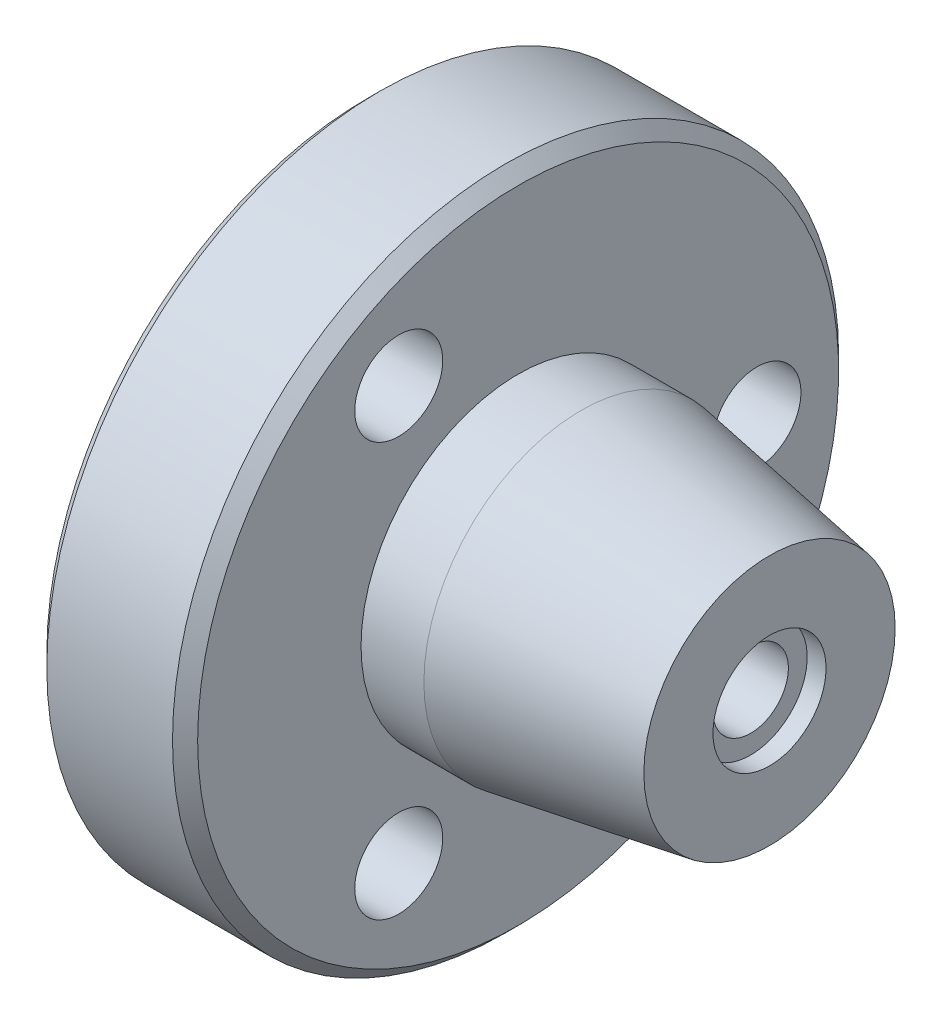
ISO-10303-21;
HEADER;
FILE_DESCRIPTION(('STEP AP214'),'2;1');
FILE_NAME('part.step','',(''),(''),'','','');
FILE_SCHEMA(('AUTOMOTIVE_DESIGN { 1 0 10303 214 1 1 1 1 }'));
ENDSEC;
DATA;
#1=APPLICATION_CONTEXT('core data for automotive mechanical design processes');
#2=APPLICATION_PROTOCOL_DEFINITION('international standard','automotive_design',2000,#1);
#3=PRODUCT_CONTEXT('',#1,'mechanical');
#4=PRODUCT('Part','Part','',(#3));
#5=PRODUCT_RELATED_PRODUCT_CATEGORY('part','',(#4));
#6=PRODUCT_DEFINITION_FORMATION('','',#4);
#7=PRODUCT_DEFINITION_CONTEXT('part definition',#1,'design');
#8=PRODUCT_DEFINITION('design','',#6,#7);
#9=PRODUCT_DEFINITION_SHAPE('','',#8);
#10=(LENGTH_UNIT() NAMED_UNIT(*) SI_UNIT(.MILLI.,.METRE.));
#11=(NAMED_UNIT(*) PLANE_ANGLE_UNIT() SI_UNIT($,.RADIAN.));
#12=(NAMED_UNIT(*) SI_UNIT($,.STERADIAN.) SOLID_ANGLE_UNIT());
#13=UNCERTAINTY_MEASURE_WITH_UNIT(LENGTH_MEASURE(1.E-05),#10,'distance_accuracy_value','');
#14=(GEOMETRIC_REPRESENTATION_CONTEXT(3) GLOBAL_UNCERTAINTY_ASSIGNED_CONTEXT((#13)) GLOBAL_UNIT_ASSIGNED_CONTEXT((#10,
#11,#12)) REPRESENTATION_CONTEXT('',''));
#15=CARTESIAN_POINT('',(0.,0.,0.));
#16=DIRECTION('',(0.,0.,1.));
#17=DIRECTION('',(1.,0.,0.));
#18=AXIS2_PLACEMENT_3D('',#15,#16,#17);
#19=CARTESIAN_POINT('',(0.,4.5,0.));
#20=DIRECTION('',(1.,0.,0.));
#21=DIRECTION('',(0.,0.,-1.));
#22=AXIS2_PLACEMENT_3D('',#19,#20,#21);
#23=PLANE('',#22);
#24=CARTESIAN_POINT('',(0.,0.,0.));
#25=DIRECTION('',(-1.,0.,0.));
#26=DIRECTION('',(0.,0.,1.));
#27=AXIS2_PLACEMENT_3D('',#24,#25,#26);
#28=CIRCLE('',#27,4.5);
#29=CARTESIAN_POINT('',(0.,0.,4.5));
#30=VERTEX_POINT('',#29);
#31=EDGE_CURVE('E67',#30,#30,#28,.T.);
#32=ORIENTED_EDGE('',*,*,#31,.F.);
#33=EDGE_LOOP('',(#32));
#34=FACE_BOUND('',#33,.T.);
#35=CARTESIAN_POINT('',(0.,0.,0.));
#36=DIRECTION('',(-1.,0.,0.));
#37=DIRECTION('',(0.,0.,1.));
#38=AXIS2_PLACEMENT_3D('',#35,#36,#37);
#39=CIRCLE('',#38,11.5);
#40=CARTESIAN_POINT('',(0.,0.,11.5));
#41=VERTEX_POINT('',#40);
#42=EDGE_CURVE('E10',#41,#41,#39,.T.);
#43=ORIENTED_EDGE('',*,*,#42,.T.);
#44=EDGE_LOOP('',(#43));
#45=FACE_BOUND('',#44,.T.);
#46=ADVANCED_FACE('F33',(#34,#45),#23,.F.);
#47=CARTESIAN_POINT('',(1.,0.,0.));
#48=DIRECTION('',(1.,0.,0.));
#49=DIRECTION('',(0.,0.,-1.));
#50=AXIS2_PLACEMENT_3D('',#47,#48,#49);
#51=CONICAL_SURFACE('',#50,12.5,0.785398163397449);
#52=ORIENTED_EDGE('',*,*,#42,.F.);
#53=EDGE_LOOP('',(#52));
#54=FACE_BOUND('',#53,.T.);
#55=CARTESIAN_POINT('',(1.,0.,0.));
#56=DIRECTION('',(-1.,0.,0.));
#57=DIRECTION('',(0.,0.,1.));
#58=AXIS2_PLACEMENT_3D('',#55,#56,#57);
#59=CIRCLE('',#58,12.5);
#60=CARTESIAN_POINT('',(1.,0.,12.5));
#61=VERTEX_POINT('',#60);
#62=EDGE_CURVE('E40',#61,#61,#59,.T.);
#63=ORIENTED_EDGE('',*,*,#62,.T.);
#64=EDGE_LOOP('',(#63));
#65=FACE_BOUND('',#64,.T.);
#66=ADVANCED_FACE('F192',(#54,#65),#51,.T.);
#67=CARTESIAN_POINT('',(0.,0.,0.));
#68=DIRECTION('',(-1.,0.,0.));
#69=DIRECTION('',(0.,0.,1.));
#70=AXIS2_PLACEMENT_3D('',#67,#68,#69);
#71=CYLINDRICAL_SURFACE('',#70,12.5);
#72=ORIENTED_EDGE('',*,*,#62,.F.);
#73=EDGE_LOOP('',(#72));
#74=FACE_BOUND('',#73,.T.);
#75=CARTESIAN_POINT('',(8.,0.,0.));
#76=DIRECTION('',(-1.,0.,0.));
#77=DIRECTION('',(0.,0.,1.));
#78=AXIS2_PLACEMENT_3D('',#75,#76,#77);
#79=CIRCLE('',#78,12.5);
#80=CARTESIAN_POINT('',(8.,0.,12.5));
#81=VERTEX_POINT('',#80);
#82=EDGE_CURVE('E45',#81,#81,#79,.T.);
#83=ORIENTED_EDGE('',*,*,#82,.T.);
#84=EDGE_LOOP('',(#83));
#85=FACE_BOUND('',#84,.T.);
#86=ADVANCED_FACE('F108',(#74,#85),#71,.T.);
#87=CARTESIAN_POINT('',(8.,12.5,0.));
#88=DIRECTION('',(1.,0.,0.));
#89=DIRECTION('',(0.,0.,-1.));
#90=AXIS2_PLACEMENT_3D('',#87,#88,#89);
#91=PLANE('',#90);
#92=CARTESIAN_POINT('',(8.,0.,-19.));
#93=DIRECTION('',(1.,0.,0.));
#94=DIRECTION('',(0.,0.,-1.));
#95=AXIS2_PLACEMENT_3D('',#92,#93,#94);
#96=CIRCLE('',#95,3.5);
#97=CARTESIAN_POINT('',(8.,0.,-22.5));
#98=VERTEX_POINT('',#97);
#99=EDGE_CURVE('E64',#98,#98,#96,.F.);
#100=ORIENTED_EDGE('',*,*,#99,.F.);
#101=EDGE_LOOP('',(#100));
#102=FACE_BOUND('',#101,.T.);
#103=CARTESIAN_POINT('',(8.,16.4544826719043,9.5));
#104=DIRECTION('',(1.,0.,0.));
#105=DIRECTION('',(0.,0.,-1.));
#106=AXIS2_PLACEMENT_3D('',#103,#104,#105);
#107=CIRCLE('',#106,3.5);
#108=CARTESIAN_POINT('',(8.,16.4544826719043,6.));
#109=VERTEX_POINT('',#108);
#110=EDGE_CURVE('E54',#109,#109,#107,.F.);
#111=ORIENTED_EDGE('',*,*,#110,.F.);
#112=EDGE_LOOP('',(#111));
#113=FACE_BOUND('',#112,.T.);
#114=CARTESIAN_POINT('',(8.,-16.4544826719043,9.50000000000001));
#115=DIRECTION('',(1.,0.,0.));
#116=DIRECTION('',(0.,0.,-1.));
#117=AXIS2_PLACEMENT_3D('',#114,#115,#116);
#118=CIRCLE('',#117,3.5);
#119=CARTESIAN_POINT('',(8.,-16.4544826719043,6.00000000000001));
#120=VERTEX_POINT('',#119);
#121=EDGE_CURVE('E51',#120,#120,#118,.F.);
#122=ORIENTED_EDGE('',*,*,#121,.F.);
#123=EDGE_LOOP('',(#122));
#124=FACE_BOUND('',#123,.T.);
#125=ORIENTED_EDGE('',*,*,#82,.F.);
#126=EDGE_LOOP('',(#125));
#127=FACE_BOUND('',#126,.T.);
#128=CARTESIAN_POINT('',(8.,0.,0.));
#129=DIRECTION('',(-1.,0.,0.));
#130=DIRECTION('',(0.,0.,1.));
#131=AXIS2_PLACEMENT_3D('',#128,#129,#130);
#132=CIRCLE('',#131,25.5);
#133=CARTESIAN_POINT('',(8.,0.,25.5));
#134=VERTEX_POINT('',#133);
#135=EDGE_CURVE('E103',#134,#134,#132,.T.);
#136=ORIENTED_EDGE('',*,*,#135,.T.);
#137=EDGE_LOOP('',(#136));
#138=FACE_BOUND('',#137,.T.);
#139=ADVANCED_FACE('F110',(#102,#113,#124,#127,#138),#91,.F.);
#140=CARTESIAN_POINT('',(9.,0.,0.));
#141=DIRECTION('',(1.,0.,0.));
#142=DIRECTION('',(0.,0.,-1.));
#143=AXIS2_PLACEMENT_3D('',#140,#141,#142);
#144=CONICAL_SURFACE('',#143,26.5,0.785398163397449);
#145=ORIENTED_EDGE('',*,*,#135,.F.);
#146=EDGE_LOOP('',(#145));
#147=FACE_BOUND('',#146,.T.);
#148=CARTESIAN_POINT('',(9.,0.,0.));
#149=DIRECTION('',(-1.,0.,0.));
#150=DIRECTION('',(0.,0.,1.));
#151=AXIS2_PLACEMENT_3D('',#148,#149,#150);
#152=CIRCLE('',#151,26.5);
#153=CARTESIAN_POINT('',(9.,0.,26.5));
#154=VERTEX_POINT('',#153);
#155=EDGE_CURVE('E100',#154,#154,#152,.T.);
#156=ORIENTED_EDGE('',*,*,#155,.T.);
#157=EDGE_LOOP('',(#156));
#158=FACE_BOUND('',#157,.T.);
#159=ADVANCED_FACE('F113',(#147,#158),#144,.T.);
#160=CARTESIAN_POINT('',(0.,0.,0.));
#161=DIRECTION('',(-1.,0.,0.));
#162=DIRECTION('',(0.,0.,1.));
#163=AXIS2_PLACEMENT_3D('',#160,#161,#162);
#164=CYLINDRICAL_SURFACE('',#163,26.5);
#165=ORIENTED_EDGE('',*,*,#155,.F.);
#166=EDGE_LOOP('',(#165));
#167=FACE_BOUND('',#166,.T.);
#168=CARTESIAN_POINT('',(19.,0.,0.));
#169=DIRECTION('',(-1.,0.,0.));
#170=DIRECTION('',(0.,0.,1.));
#171=AXIS2_PLACEMENT_3D('',#168,#169,#170);
#172=CIRCLE('',#171,26.5);
#173=CARTESIAN_POINT('',(19.,0.,26.5));
#174=VERTEX_POINT('',#173);
#175=EDGE_CURVE('E97',#174,#174,#172,.T.);
#176=ORIENTED_EDGE('',*,*,#175,.T.);
#177=EDGE_LOOP('',(#176));
#178=FACE_BOUND('',#177,.T.);
#179=ADVANCED_FACE('F120',(#167,#178),#164,.T.);
#180=CARTESIAN_POINT('',(20.,0.,0.));
#181=DIRECTION('',(-1.,0.,0.));
#182=DIRECTION('',(0.,0.,1.));
#183=AXIS2_PLACEMENT_3D('',#180,#181,#182);
#184=CONICAL_SURFACE('',#183,25.5,0.785398163397448);
#185=ORIENTED_EDGE('',*,*,#175,.F.);
#186=EDGE_LOOP('',(#185));
#187=FACE_BOUND('',#186,.T.);
#188=CARTESIAN_POINT('',(20.,0.,0.));
#189=DIRECTION('',(-1.,0.,0.));
#190=DIRECTION('',(0.,0.,1.));
#191=AXIS2_PLACEMENT_3D('',#188,#189,#190);
#192=CIRCLE('',#191,25.5);
#193=CARTESIAN_POINT('',(20.,0.,25.5));
#194=VERTEX_POINT('',#193);
#195=EDGE_CURVE('E94',#194,#194,#192,.T.);
#196=ORIENTED_EDGE('',*,*,#195,.T.);
#197=EDGE_LOOP('',(#196));
#198=FACE_BOUND('',#197,.T.);
#199=ADVANCED_FACE('F126',(#187,#198),#184,.T.);
#200=CARTESIAN_POINT('',(20.,25.5,0.));
#201=DIRECTION('',(-1.,0.,0.));
#202=DIRECTION('',(0.,0.,1.));
#203=AXIS2_PLACEMENT_3D('',#200,#201,#202);
#204=PLANE('',#203);
#205=CARTESIAN_POINT('',(20.,0.,-19.));
#206=DIRECTION('',(-1.,0.,0.));
#207=DIRECTION('',(0.,0.,1.));
#208=AXIS2_PLACEMENT_3D('',#205,#206,#207);
#209=CIRCLE('',#208,3.5);
#210=CARTESIAN_POINT('',(20.,0.,-15.5));
#211=VERTEX_POINT('',#210);
#212=EDGE_CURVE('E36',#211,#211,#209,.F.);
#213=ORIENTED_EDGE('',*,*,#212,.F.);
#214=EDGE_LOOP('',(#213));
#215=FACE_BOUND('',#214,.T.);
#216=CARTESIAN_POINT('',(20.,16.4544826719043,9.5));
#217=DIRECTION('',(-1.,0.,0.));
#218=DIRECTION('',(0.,0.,1.));
#219=AXIS2_PLACEMENT_3D('',#216,#217,#218);
#220=CIRCLE('',#219,3.5);
#221=CARTESIAN_POINT('',(20.,16.4544826719043,13.));
#222=VERTEX_POINT('',#221);
#223=EDGE_CURVE('E52',#222,#222,#220,.F.);
#224=ORIENTED_EDGE('',*,*,#223,.F.);
#225=EDGE_LOOP('',(#224));
#226=FACE_BOUND('',#225,.T.);
#227=CARTESIAN_POINT('',(20.,-16.4544826719043,9.50000000000001));
#228=DIRECTION('',(-1.,0.,0.));
#229=DIRECTION('',(0.,0.,1.));
#230=AXIS2_PLACEMENT_3D('',#227,#228,#229);
#231=CIRCLE('',#230,3.5);
#232=CARTESIAN_POINT('',(20.,-16.4544826719043,13.));
#233=VERTEX_POINT('',#232);
#234=EDGE_CURVE('E49',#233,#233,#231,.F.);
#235=ORIENTED_EDGE('',*,*,#234,.F.);
#236=EDGE_LOOP('',(#235));
#237=FACE_BOUND('',#236,.T.);
#238=ORIENTED_EDGE('',*,*,#195,.F.);
#239=EDGE_LOOP('',(#238));
#240=FACE_BOUND('',#239,.T.);
#241=CARTESIAN_POINT('',(20.,0.,0.));
#242=DIRECTION('',(-1.,0.,0.));
#243=DIRECTION('',(0.,0.,1.));
#244=AXIS2_PLACEMENT_3D('',#241,#242,#243);
#245=CIRCLE('',#244,12.5);
#246=CARTESIAN_POINT('',(20.,0.,12.5));
#247=VERTEX_POINT('',#246);
#248=EDGE_CURVE('E91',#247,#247,#245,.T.);
#249=ORIENTED_EDGE('',*,*,#248,.T.);
#250=EDGE_LOOP('',(#249));
#251=FACE_BOUND('',#250,.T.);
#252=ADVANCED_FACE('F132',(#215,#226,#237,#240,#251),#204,.F.);
#253=CARTESIAN_POINT('',(0.,0.,0.));
#254=DIRECTION('',(-1.,0.,0.));
#255=DIRECTION('',(0.,0.,1.));
#256=AXIS2_PLACEMENT_3D('',#253,#254,#255);
#257=CYLINDRICAL_SURFACE('',#256,12.5);
#258=ORIENTED_EDGE('',*,*,#248,.F.);
#259=EDGE_LOOP('',(#258));
#260=FACE_BOUND('',#259,.T.);
#261=CARTESIAN_POINT('',(25.,0.,0.));
#262=DIRECTION('',(-1.,0.,0.));
#263=DIRECTION('',(0.,0.,1.));
#264=AXIS2_PLACEMENT_3D('',#261,#262,#263);
#265=CIRCLE('',#264,12.5);
#266=CARTESIAN_POINT('',(25.,0.,12.5));
#267=VERTEX_POINT('',#266);
#268=EDGE_CURVE('E88',#267,#267,#265,.T.);
#269=ORIENTED_EDGE('',*,*,#268,.T.);
#270=EDGE_LOOP('',(#269));
#271=FACE_BOUND('',#270,.T.);
#272=ADVANCED_FACE('F138',(#260,#271),#257,.T.);
#273=CARTESIAN_POINT('',(40.,0.,0.));
#274=DIRECTION('',(-1.,0.,0.));
#275=DIRECTION('',(0.,0.,1.));
#276=AXIS2_PLACEMENT_3D('',#273,#274,#275);
#277=CONICAL_SURFACE('',#276,10.,0.165148677414627);
#278=ORIENTED_EDGE('',*,*,#268,.F.);
#279=EDGE_LOOP('',(#278));
#280=FACE_BOUND('',#279,.T.);
#281=CARTESIAN_POINT('',(40.,0.,0.));
#282=DIRECTION('',(-1.,0.,0.));
#283=DIRECTION('',(0.,0.,1.));
#284=AXIS2_PLACEMENT_3D('',#281,#282,#283);
#285=CIRCLE('',#284,10.);
#286=CARTESIAN_POINT('',(40.,0.,10.));
#287=VERTEX_POINT('',#286);
#288=EDGE_CURVE('E85',#287,#287,#285,.T.);
#289=ORIENTED_EDGE('',*,*,#288,.T.);
#290=EDGE_LOOP('',(#289));
#291=FACE_BOUND('',#290,.T.);
#292=ADVANCED_FACE('F145',(#280,#291),#277,.T.);
#293=CARTESIAN_POINT('',(40.,10.,0.));
#294=DIRECTION('',(-1.,0.,0.));
#295=DIRECTION('',(0.,0.,1.));
#296=AXIS2_PLACEMENT_3D('',#293,#294,#295);
#297=PLANE('',#296);
#298=ORIENTED_EDGE('',*,*,#288,.F.);
#299=EDGE_LOOP('',(#298));
#300=FACE_BOUND('',#299,.T.);
#301=CARTESIAN_POINT('',(40.,0.,0.));
#302=DIRECTION('',(-1.,0.,0.));
#303=DIRECTION('',(0.,0.,1.));
#304=AXIS2_PLACEMENT_3D('',#301,#302,#303);
#305=CIRCLE('',#304,4.5);
#306=CARTESIAN_POINT('',(40.,0.,4.5));
#307=VERTEX_POINT('',#306);
#308=EDGE_CURVE('E82',#307,#307,#305,.T.);
#309=ORIENTED_EDGE('',*,*,#308,.T.);
#310=EDGE_LOOP('',(#309));
#311=FACE_BOUND('',#310,.T.);
#312=ADVANCED_FACE('F151',(#300,#311),#297,.F.);
#313=CARTESIAN_POINT('',(0.,0.,0.));
#314=DIRECTION('',(-1.,0.,0.));
#315=DIRECTION('',(0.,0.,1.));
#316=AXIS2_PLACEMENT_3D('',#313,#314,#315);
#317=CYLINDRICAL_SURFACE('',#316,4.5);
#318=ORIENTED_EDGE('',*,*,#308,.F.);
#319=EDGE_LOOP('',(#318));
#320=FACE_BOUND('',#319,.T.);
#321=CARTESIAN_POINT('',(38.5,0.,0.));
#322=DIRECTION('',(-1.,0.,0.));
#323=DIRECTION('',(0.,0.,1.));
#324=AXIS2_PLACEMENT_3D('',#321,#322,#323);
#325=CIRCLE('',#324,4.5);
#326=CARTESIAN_POINT('',(38.5,0.,4.5));
#327=VERTEX_POINT('',#326);
#328=EDGE_CURVE('E79',#327,#327,#325,.T.);
#329=ORIENTED_EDGE('',*,*,#328,.T.);
#330=EDGE_LOOP('',(#329));
#331=FACE_BOUND('',#330,.T.);
#332=ADVANCED_FACE('F157',(#320,#331),#317,.F.);
#333=CARTESIAN_POINT('',(38.5,4.5,0.));
#334=DIRECTION('',(-1.,0.,0.));
#335=DIRECTION('',(0.,0.,1.));
#336=AXIS2_PLACEMENT_3D('',#333,#334,#335);
#337=PLANE('',#336);
#338=ORIENTED_EDGE('',*,*,#328,.F.);
#339=EDGE_LOOP('',(#338));
#340=FACE_BOUND('',#339,.T.);
#341=CARTESIAN_POINT('',(38.5,0.,0.));
#342=DIRECTION('',(-1.,0.,0.));
#343=DIRECTION('',(0.,0.,1.));
#344=AXIS2_PLACEMENT_3D('',#341,#342,#343);
#345=CIRCLE('',#344,3.);
#346=CARTESIAN_POINT('',(38.5,0.,3.));
#347=VERTEX_POINT('',#346);
#348=EDGE_CURVE('E76',#347,#347,#345,.T.);
#349=ORIENTED_EDGE('',*,*,#348,.T.);
#350=EDGE_LOOP('',(#349));
#351=FACE_BOUND('',#350,.T.);
#352=ADVANCED_FACE('F163',(#340,#351),#337,.F.);
#353=CARTESIAN_POINT('',(0.,0.,0.));
#354=DIRECTION('',(-1.,0.,0.));
#355=DIRECTION('',(0.,0.,1.));
#356=AXIS2_PLACEMENT_3D('',#353,#354,#355);
#357=CYLINDRICAL_SURFACE('',#356,3.);
#358=ORIENTED_EDGE('',*,*,#348,.F.);
#359=EDGE_LOOP('',(#358));
#360=FACE_BOUND('',#359,.T.);
#361=CARTESIAN_POINT('',(1.5,0.,0.));
#362=DIRECTION('',(-1.,0.,0.));
#363=DIRECTION('',(0.,0.,1.));
#364=AXIS2_PLACEMENT_3D('',#361,#362,#363);
#365=CIRCLE('',#364,3.);
#366=CARTESIAN_POINT('',(1.5,0.,3.));
#367=VERTEX_POINT('',#366);
#368=EDGE_CURVE('E73',#367,#367,#365,.T.);
#369=ORIENTED_EDGE('',*,*,#368,.T.);
#370=EDGE_LOOP('',(#369));
#371=FACE_BOUND('',#370,.T.);
#372=ADVANCED_FACE('F169',(#360,#371),#357,.F.);
#373=CARTESIAN_POINT('',(1.5,3.,0.));
#374=DIRECTION('',(1.,0.,0.));
#375=DIRECTION('',(0.,0.,-1.));
#376=AXIS2_PLACEMENT_3D('',#373,#374,#375);
#377=PLANE('',#376);
#378=ORIENTED_EDGE('',*,*,#368,.F.);
#379=EDGE_LOOP('',(#378));
#380=FACE_BOUND('',#379,.T.);
#381=CARTESIAN_POINT('',(1.5,0.,0.));
#382=DIRECTION('',(-1.,0.,0.));
#383=DIRECTION('',(0.,0.,1.));
#384=AXIS2_PLACEMENT_3D('',#381,#382,#383);
#385=CIRCLE('',#384,4.5);
#386=CARTESIAN_POINT('',(1.5,0.,4.5));
#387=VERTEX_POINT('',#386);
#388=EDGE_CURVE('E70',#387,#387,#385,.T.);
#389=ORIENTED_EDGE('',*,*,#388,.T.);
#390=EDGE_LOOP('',(#389));
#391=FACE_BOUND('',#390,.T.);
#392=ADVANCED_FACE('F175',(#380,#391),#377,.F.);
#393=CARTESIAN_POINT('',(0.,0.,0.));
#394=DIRECTION('',(-1.,0.,0.));
#395=DIRECTION('',(0.,0.,1.));
#396=AXIS2_PLACEMENT_3D('',#393,#394,#395);
#397=CYLINDRICAL_SURFACE('',#396,4.5);
#398=ORIENTED_EDGE('',*,*,#388,.F.);
#399=EDGE_LOOP('',(#398));
#400=FACE_BOUND('',#399,.T.);
#401=ORIENTED_EDGE('',*,*,#31,.T.);
#402=EDGE_LOOP('',(#401));
#403=FACE_BOUND('',#402,.T.);
#404=ADVANCED_FACE('F181',(#400,#403),#397,.F.);
#405=CARTESIAN_POINT('',(40.,-16.4544826719043,9.50000000000001));
#406=DIRECTION('',(-1.,0.,0.));
#407=DIRECTION('',(0.,0.,1.));
#408=AXIS2_PLACEMENT_3D('',#405,#406,#407);
#409=CYLINDRICAL_SURFACE('',#408,3.5);
#410=ORIENTED_EDGE('',*,*,#234,.T.);
#411=EDGE_LOOP('',(#410));
#412=FACE_BOUND('',#411,.T.);
#413=ORIENTED_EDGE('',*,*,#121,.T.);
#414=EDGE_LOOP('',(#413));
#415=FACE_BOUND('',#414,.T.);
#416=ADVANCED_FACE('F187',(#412,#415),#409,.F.);
#417=CARTESIAN_POINT('',(40.,16.4544826719043,9.5));
#418=DIRECTION('',(-1.,0.,0.));
#419=DIRECTION('',(0.,0.,1.));
#420=AXIS2_PLACEMENT_3D('',#417,#418,#419);
#421=CYLINDRICAL_SURFACE('',#420,3.5);
#422=ORIENTED_EDGE('',*,*,#223,.T.);
#423=EDGE_LOOP('',(#422));
#424=FACE_BOUND('',#423,.T.);
#425=ORIENTED_EDGE('',*,*,#110,.T.);
#426=EDGE_LOOP('',(#425));
#427=FACE_BOUND('',#426,.T.);
#428=ADVANCED_FACE('F206',(#424,#427),#421,.F.);
#429=CARTESIAN_POINT('',(40.,0.,-19.));
#430=DIRECTION('',(-1.,0.,0.));
#431=DIRECTION('',(0.,0.,1.));
#432=AXIS2_PLACEMENT_3D('',#429,#430,#431);
#433=CYLINDRICAL_SURFACE('',#432,3.5);
#434=ORIENTED_EDGE('',*,*,#212,.T.);
#435=EDGE_LOOP('',(#434));
#436=FACE_BOUND('',#435,.T.);
#437=ORIENTED_EDGE('',*,*,#99,.T.);
#438=EDGE_LOOP('',(#437));
#439=FACE_BOUND('',#438,.T.);
#440=ADVANCED_FACE('F210',(#436,#439),#433,.F.);
#441=CLOSED_SHELL('',(#46,#66,#86,#139,#159,#179,#199,#252,#272,#292,#312,#332,#352,#372,#392,
#404,#416,#428,#440));
#442=MANIFOLD_SOLID_BREP('B2',#441);
#443=ADVANCED_BREP_SHAPE_REPRESENTATION('',(#18,#442),#14);
#444=SHAPE_DEFINITION_REPRESENTATION(#9,#443);
ENDSEC;
END-ISO-10303-21;
